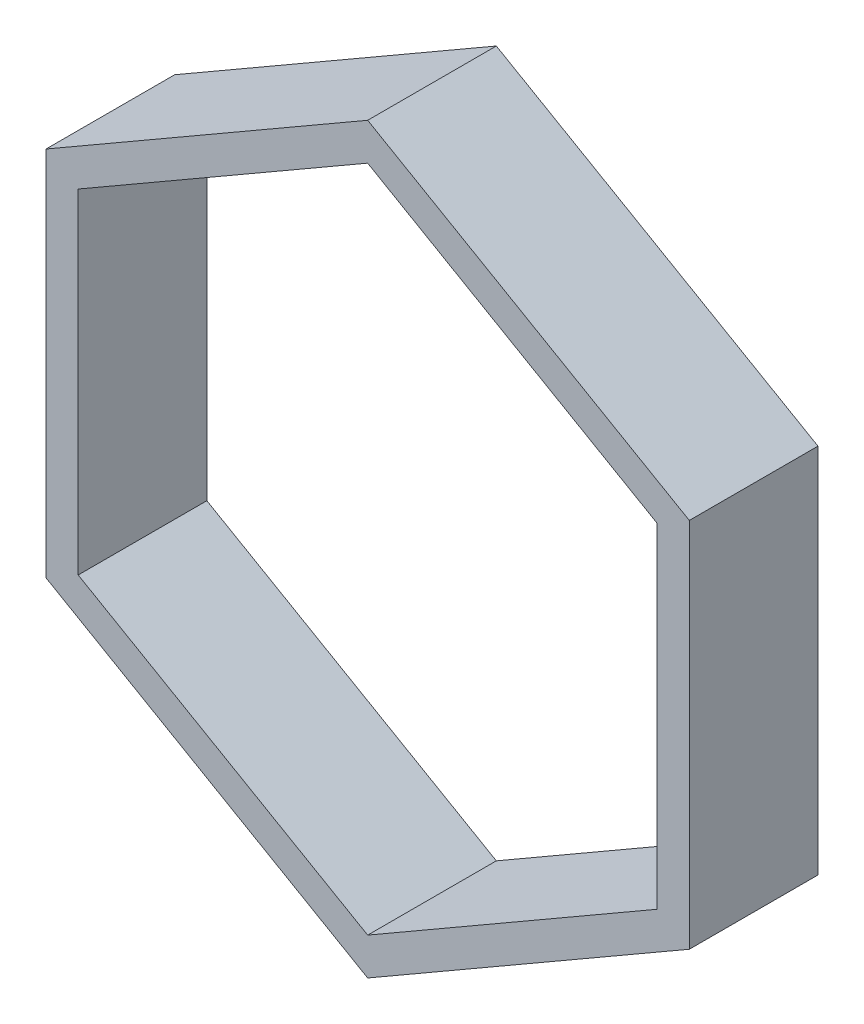
ISO-10303-21;
HEADER;
FILE_DESCRIPTION(('STEP AP214'),'2;1');
FILE_NAME('part.step','',(''),(''),'','','');
FILE_SCHEMA(('AUTOMOTIVE_DESIGN { 1 0 10303 214 1 1 1 1 }'));
ENDSEC;
DATA;
#1=APPLICATION_CONTEXT('core data for automotive mechanical design processes');
#2=APPLICATION_PROTOCOL_DEFINITION('international standard','automotive_design',2000,#1);
#3=PRODUCT_CONTEXT('',#1,'mechanical');
#4=PRODUCT('Part','Part','',(#3));
#5=PRODUCT_RELATED_PRODUCT_CATEGORY('part','',(#4));
#6=PRODUCT_DEFINITION_FORMATION('','',#4);
#7=PRODUCT_DEFINITION_CONTEXT('part definition',#1,'design');
#8=PRODUCT_DEFINITION('design','',#6,#7);
#9=PRODUCT_DEFINITION_SHAPE('','',#8);
#10=(LENGTH_UNIT() NAMED_UNIT(*) SI_UNIT(.MILLI.,.METRE.));
#11=(NAMED_UNIT(*) PLANE_ANGLE_UNIT() SI_UNIT($,.RADIAN.));
#12=(NAMED_UNIT(*) SI_UNIT($,.STERADIAN.) SOLID_ANGLE_UNIT());
#13=UNCERTAINTY_MEASURE_WITH_UNIT(LENGTH_MEASURE(1.E-05),#10,'distance_accuracy_value','');
#14=(GEOMETRIC_REPRESENTATION_CONTEXT(3) GLOBAL_UNCERTAINTY_ASSIGNED_CONTEXT((#13)) GLOBAL_UNIT_ASSIGNED_CONTEXT((#10,
#11,#12)) REPRESENTATION_CONTEXT('',''));
#15=CARTESIAN_POINT('',(0.,0.,0.));
#16=DIRECTION('',(0.,0.,1.));
#17=DIRECTION('',(1.,0.,0.));
#18=AXIS2_PLACEMENT_3D('',#15,#16,#17);
#19=CARTESIAN_POINT('',(0.,0.,4.));
#20=DIRECTION('',(0.,0.,1.));
#21=DIRECTION('',(1.,0.,0.));
#22=AXIS2_PLACEMENT_3D('',#19,#20,#21);
#23=PLANE('',#22);
#24=DIRECTION('',(-0.866025403784439,0.499999999999999,0.));
#25=VECTOR('',#24,1.);
#26=CARTESIAN_POINT('',(9.99999999999999,5.77350269189628,4.));
#27=LINE('',#26,#25);
#28=CARTESIAN_POINT('',(9.99999999999999,5.77350269189628,4.));
#29=VERTEX_POINT('',#28);
#30=CARTESIAN_POINT('',(0.,11.5470053837925,4.));
#31=VERTEX_POINT('',#30);
#32=EDGE_CURVE('E176',#29,#31,#27,.T.);
#33=ORIENTED_EDGE('',*,*,#32,.T.);
#34=DIRECTION('',(-0.866025403784439,-0.5,0.));
#35=VECTOR('',#34,1.);
#36=CARTESIAN_POINT('',(0.,11.5470053837925,4.));
#37=LINE('',#36,#35);
#38=CARTESIAN_POINT('',(-10.,5.77350269189628,4.));
#39=VERTEX_POINT('',#38);
#40=EDGE_CURVE('E179',#31,#39,#37,.T.);
#41=ORIENTED_EDGE('',*,*,#40,.T.);
#42=DIRECTION('',(0.,-1.,0.));
#43=VECTOR('',#42,1.);
#44=CARTESIAN_POINT('',(-10.,5.77350269189628,4.));
#45=LINE('',#44,#43);
#46=CARTESIAN_POINT('',(-10.,-5.77350269189624,4.));
#47=VERTEX_POINT('',#46);
#48=EDGE_CURVE('E182',#39,#47,#45,.T.);
#49=ORIENTED_EDGE('',*,*,#48,.T.);
#50=DIRECTION('',(0.866025403784439,-0.5,0.));
#51=VECTOR('',#50,1.);
#52=CARTESIAN_POINT('',(-10.,-5.77350269189624,4.));
#53=LINE('',#52,#51);
#54=CARTESIAN_POINT('',(0.,-11.5470053837925,4.));
#55=VERTEX_POINT('',#54);
#56=EDGE_CURVE('E184',#47,#55,#53,.T.);
#57=ORIENTED_EDGE('',*,*,#56,.T.);
#58=DIRECTION('',(0.866025403784439,0.5,0.));
#59=VECTOR('',#58,1.);
#60=CARTESIAN_POINT('',(0.,-11.5470053837925,4.));
#61=LINE('',#60,#59);
#62=CARTESIAN_POINT('',(9.99999999999999,-5.77350269189624,4.));
#63=VERTEX_POINT('',#62);
#64=EDGE_CURVE('E186',#55,#63,#61,.T.);
#65=ORIENTED_EDGE('',*,*,#64,.T.);
#66=DIRECTION('',(0.,1.,0.));
#67=VECTOR('',#66,1.);
#68=CARTESIAN_POINT('',(9.99999999999999,-5.77350269189624,4.));
#69=LINE('',#68,#67);
#70=EDGE_CURVE('E188',#63,#29,#69,.T.);
#71=ORIENTED_EDGE('',*,*,#70,.T.);
#72=EDGE_LOOP('',(#33,#41,#49,#57,#65,#71));
#73=FACE_BOUND('',#72,.T.);
#74=DIRECTION('',(-0.866025403784439,-0.499999999999999,0.));
#75=VECTOR('',#74,1.);
#76=CARTESIAN_POINT('',(0.,10.3923048454133,4.));
#77=LINE('',#76,#75);
#78=CARTESIAN_POINT('',(0.,10.3923048454133,4.));
#79=VERTEX_POINT('',#78);
#80=CARTESIAN_POINT('',(-9.,5.19615242270666,4.));
#81=VERTEX_POINT('',#80);
#82=EDGE_CURVE('E133',#79,#81,#77,.T.);
#83=ORIENTED_EDGE('',*,*,#82,.F.);
#84=DIRECTION('',(-0.866025403784439,0.5,0.));
#85=VECTOR('',#84,1.);
#86=CARTESIAN_POINT('',(8.99999999999999,5.19615242270665,4.));
#87=LINE('',#86,#85);
#88=CARTESIAN_POINT('',(8.99999999999999,5.19615242270665,4.));
#89=VERTEX_POINT('',#88);
#90=EDGE_CURVE('E125',#89,#79,#87,.T.);
#91=ORIENTED_EDGE('',*,*,#90,.F.);
#92=DIRECTION('',(0.,1.,0.));
#93=VECTOR('',#92,1.);
#94=CARTESIAN_POINT('',(8.99999999999999,-5.19615242270662,4.));
#95=LINE('',#94,#93);
#96=CARTESIAN_POINT('',(8.99999999999999,-5.19615242270662,4.));
#97=VERTEX_POINT('',#96);
#98=EDGE_CURVE('E154',#97,#89,#95,.T.);
#99=ORIENTED_EDGE('',*,*,#98,.F.);
#100=DIRECTION('',(0.866025403784439,0.5,0.));
#101=VECTOR('',#100,1.);
#102=CARTESIAN_POINT('',(0.,-10.3923048454132,4.));
#103=LINE('',#102,#101);
#104=CARTESIAN_POINT('',(0.,-10.3923048454132,4.));
#105=VERTEX_POINT('',#104);
#106=EDGE_CURVE('E152',#105,#97,#103,.T.);
#107=ORIENTED_EDGE('',*,*,#106,.F.);
#108=DIRECTION('',(0.866025403784439,-0.5,0.));
#109=VECTOR('',#108,1.);
#110=CARTESIAN_POINT('',(-9.,-5.19615242270662,4.));
#111=LINE('',#110,#109);
#112=CARTESIAN_POINT('',(-9.,-5.19615242270662,4.));
#113=VERTEX_POINT('',#112);
#114=EDGE_CURVE('E148',#113,#105,#111,.T.);
#115=ORIENTED_EDGE('',*,*,#114,.F.);
#116=DIRECTION('',(0.,-1.,0.));
#117=VECTOR('',#116,1.);
#118=CARTESIAN_POINT('',(-9.,5.19615242270666,4.));
#119=LINE('',#118,#117);
#120=EDGE_CURVE('E146',#81,#113,#119,.T.);
#121=ORIENTED_EDGE('',*,*,#120,.F.);
#122=EDGE_LOOP('',(#83,#91,#99,#107,#115,#121));
#123=FACE_BOUND('',#122,.T.);
#124=ADVANCED_FACE('F36',(#73,#123),#23,.T.);
#125=CARTESIAN_POINT('',(0.,0.,0.));
#126=DIRECTION('',(0.,0.,1.));
#127=DIRECTION('',(1.,0.,0.));
#128=AXIS2_PLACEMENT_3D('',#125,#126,#127);
#129=PLANE('',#128);
#130=DIRECTION('',(-0.866025403784439,0.499999999999999,0.));
#131=VECTOR('',#130,1.);
#132=CARTESIAN_POINT('',(9.99999999999999,5.77350269189628,0.));
#133=LINE('',#132,#131);
#134=CARTESIAN_POINT('',(9.99999999999999,5.77350269189628,0.));
#135=VERTEX_POINT('',#134);
#136=CARTESIAN_POINT('',(0.,11.5470053837925,0.));
#137=VERTEX_POINT('',#136);
#138=EDGE_CURVE('E141',#135,#137,#133,.T.);
#139=ORIENTED_EDGE('',*,*,#138,.F.);
#140=DIRECTION('',(0.,1.,0.));
#141=VECTOR('',#140,1.);
#142=CARTESIAN_POINT('',(9.99999999999999,-5.77350269189624,0.));
#143=LINE('',#142,#141);
#144=CARTESIAN_POINT('',(9.99999999999999,-5.77350269189624,0.));
#145=VERTEX_POINT('',#144);
#146=EDGE_CURVE('E180',#145,#135,#143,.T.);
#147=ORIENTED_EDGE('',*,*,#146,.F.);
#148=DIRECTION('',(0.866025403784439,0.5,0.));
#149=VECTOR('',#148,1.);
#150=CARTESIAN_POINT('',(0.,-11.5470053837925,0.));
#151=LINE('',#150,#149);
#152=CARTESIAN_POINT('',(0.,-11.5470053837925,0.));
#153=VERTEX_POINT('',#152);
#154=EDGE_CURVE('E199',#153,#145,#151,.T.);
#155=ORIENTED_EDGE('',*,*,#154,.F.);
#156=DIRECTION('',(0.866025403784439,-0.5,0.));
#157=VECTOR('',#156,1.);
#158=CARTESIAN_POINT('',(-10.,-5.77350269189624,0.));
#159=LINE('',#158,#157);
#160=CARTESIAN_POINT('',(-10.,-5.77350269189624,0.));
#161=VERTEX_POINT('',#160);
#162=EDGE_CURVE('E197',#161,#153,#159,.T.);
#163=ORIENTED_EDGE('',*,*,#162,.F.);
#164=DIRECTION('',(0.,-1.,0.));
#165=VECTOR('',#164,1.);
#166=CARTESIAN_POINT('',(-10.,5.77350269189628,0.));
#167=LINE('',#166,#165);
#168=CARTESIAN_POINT('',(-10.,5.77350269189628,0.));
#169=VERTEX_POINT('',#168);
#170=EDGE_CURVE('E195',#169,#161,#167,.T.);
#171=ORIENTED_EDGE('',*,*,#170,.F.);
#172=DIRECTION('',(-0.866025403784439,-0.5,0.));
#173=VECTOR('',#172,1.);
#174=CARTESIAN_POINT('',(0.,11.5470053837925,0.));
#175=LINE('',#174,#173);
#176=EDGE_CURVE('E193',#137,#169,#175,.T.);
#177=ORIENTED_EDGE('',*,*,#176,.F.);
#178=EDGE_LOOP('',(#139,#147,#155,#163,#171,#177));
#179=FACE_BOUND('',#178,.T.);
#180=DIRECTION('',(-0.866025403784439,0.5,0.));
#181=VECTOR('',#180,1.);
#182=CARTESIAN_POINT('',(8.99999999999999,5.19615242270665,0.));
#183=LINE('',#182,#181);
#184=CARTESIAN_POINT('',(8.99999999999999,5.19615242270665,0.));
#185=VERTEX_POINT('',#184);
#186=CARTESIAN_POINT('',(0.,10.3923048454133,0.));
#187=VERTEX_POINT('',#186);
#188=EDGE_CURVE('E59',#185,#187,#183,.T.);
#189=ORIENTED_EDGE('',*,*,#188,.T.);
#190=DIRECTION('',(-0.866025403784439,-0.499999999999999,0.));
#191=VECTOR('',#190,1.);
#192=CARTESIAN_POINT('',(0.,10.3923048454133,0.));
#193=LINE('',#192,#191);
#194=CARTESIAN_POINT('',(-9.,5.19615242270666,0.));
#195=VERTEX_POINT('',#194);
#196=EDGE_CURVE('E140',#187,#195,#193,.T.);
#197=ORIENTED_EDGE('',*,*,#196,.T.);
#198=DIRECTION('',(0.,-1.,0.));
#199=VECTOR('',#198,1.);
#200=CARTESIAN_POINT('',(-9.,5.19615242270666,0.));
#201=LINE('',#200,#199);
#202=CARTESIAN_POINT('',(-9.,-5.19615242270662,0.));
#203=VERTEX_POINT('',#202);
#204=EDGE_CURVE('E158',#195,#203,#201,.T.);
#205=ORIENTED_EDGE('',*,*,#204,.T.);
#206=DIRECTION('',(0.866025403784439,-0.5,0.));
#207=VECTOR('',#206,1.);
#208=CARTESIAN_POINT('',(-9.,-5.19615242270662,0.));
#209=LINE('',#208,#207);
#210=CARTESIAN_POINT('',(0.,-10.3923048454132,0.));
#211=VERTEX_POINT('',#210);
#212=EDGE_CURVE('E161',#203,#211,#209,.T.);
#213=ORIENTED_EDGE('',*,*,#212,.T.);
#214=DIRECTION('',(0.866025403784439,0.5,0.));
#215=VECTOR('',#214,1.);
#216=CARTESIAN_POINT('',(0.,-10.3923048454132,0.));
#217=LINE('',#216,#215);
#218=CARTESIAN_POINT('',(8.99999999999999,-5.19615242270662,0.));
#219=VERTEX_POINT('',#218);
#220=EDGE_CURVE('E164',#211,#219,#217,.T.);
#221=ORIENTED_EDGE('',*,*,#220,.T.);
#222=DIRECTION('',(0.,1.,0.));
#223=VECTOR('',#222,1.);
#224=CARTESIAN_POINT('',(8.99999999999999,-5.19615242270662,0.));
#225=LINE('',#224,#223);
#226=EDGE_CURVE('E134',#219,#185,#225,.T.);
#227=ORIENTED_EDGE('',*,*,#226,.T.);
#228=EDGE_LOOP('',(#189,#197,#205,#213,#221,#227));
#229=FACE_BOUND('',#228,.T.);
#230=ADVANCED_FACE('F223',(#179,#229),#129,.F.);
#231=CARTESIAN_POINT('',(9.99999999999999,5.77350269189628,4.));
#232=DIRECTION('',(-0.5,-0.866025403784439,0.));
#233=DIRECTION('',(0.866025403784439,-0.5,0.));
#234=AXIS2_PLACEMENT_3D('',#231,#232,#233);
#235=PLANE('',#234);
#236=ORIENTED_EDGE('',*,*,#138,.T.);
#237=DIRECTION('',(0.,0.,-1.));
#238=VECTOR('',#237,1.);
#239=CARTESIAN_POINT('',(0.,11.5470053837925,4.));
#240=LINE('',#239,#238);
#241=EDGE_CURVE('E11',#31,#137,#240,.T.);
#242=ORIENTED_EDGE('',*,*,#241,.F.);
#243=ORIENTED_EDGE('',*,*,#32,.F.);
#244=DIRECTION('',(0.,0.,-1.));
#245=VECTOR('',#244,1.);
#246=CARTESIAN_POINT('',(9.99999999999999,5.77350269189628,4.));
#247=LINE('',#246,#245);
#248=EDGE_CURVE('E190',#29,#135,#247,.T.);
#249=ORIENTED_EDGE('',*,*,#248,.T.);
#250=EDGE_LOOP('',(#236,#242,#243,#249));
#251=FACE_BOUND('',#250,.T.);
#252=ADVANCED_FACE('F38',(#251),#235,.F.);
#253=CARTESIAN_POINT('',(0.,11.5470053837925,4.));
#254=DIRECTION('',(0.5,-0.866025403784439,0.));
#255=DIRECTION('',(0.866025403784439,0.5,0.));
#256=AXIS2_PLACEMENT_3D('',#253,#254,#255);
#257=PLANE('',#256);
#258=ORIENTED_EDGE('',*,*,#176,.T.);
#259=DIRECTION('',(0.,0.,-1.));
#260=VECTOR('',#259,1.);
#261=CARTESIAN_POINT('',(-10.,5.77350269189628,4.));
#262=LINE('',#261,#260);
#263=EDGE_CURVE('E44',#39,#169,#262,.T.);
#264=ORIENTED_EDGE('',*,*,#263,.F.);
#265=ORIENTED_EDGE('',*,*,#40,.F.);
#266=ORIENTED_EDGE('',*,*,#241,.T.);
#267=EDGE_LOOP('',(#258,#264,#265,#266));
#268=FACE_BOUND('',#267,.T.);
#269=ADVANCED_FACE('F240',(#268),#257,.F.);
#270=CARTESIAN_POINT('',(-10.,5.77350269189628,4.));
#271=DIRECTION('',(1.,0.,0.));
#272=DIRECTION('',(0.,0.,-1.));
#273=AXIS2_PLACEMENT_3D('',#270,#271,#272);
#274=PLANE('',#273);
#275=ORIENTED_EDGE('',*,*,#170,.T.);
#276=DIRECTION('',(0.,0.,-1.));
#277=VECTOR('',#276,1.);
#278=CARTESIAN_POINT('',(-10.,-5.77350269189624,4.));
#279=LINE('',#278,#277);
#280=EDGE_CURVE('E210',#47,#161,#279,.T.);
#281=ORIENTED_EDGE('',*,*,#280,.F.);
#282=ORIENTED_EDGE('',*,*,#48,.F.);
#283=ORIENTED_EDGE('',*,*,#263,.T.);
#284=EDGE_LOOP('',(#275,#281,#282,#283));
#285=FACE_BOUND('',#284,.T.);
#286=ADVANCED_FACE('F217',(#285),#274,.F.);
#287=CARTESIAN_POINT('',(-10.,-5.77350269189624,4.));
#288=DIRECTION('',(0.5,0.866025403784439,0.));
#289=DIRECTION('',(-0.866025403784439,0.5,0.));
#290=AXIS2_PLACEMENT_3D('',#287,#288,#289);
#291=PLANE('',#290);
#292=ORIENTED_EDGE('',*,*,#162,.T.);
#293=DIRECTION('',(0.,0.,-1.));
#294=VECTOR('',#293,1.);
#295=CARTESIAN_POINT('',(0.,-11.5470053837925,4.));
#296=LINE('',#295,#294);
#297=EDGE_CURVE('E207',#55,#153,#296,.T.);
#298=ORIENTED_EDGE('',*,*,#297,.F.);
#299=ORIENTED_EDGE('',*,*,#56,.F.);
#300=ORIENTED_EDGE('',*,*,#280,.T.);
#301=EDGE_LOOP('',(#292,#298,#299,#300));
#302=FACE_BOUND('',#301,.T.);
#303=ADVANCED_FACE('F229',(#302),#291,.F.);
#304=CARTESIAN_POINT('',(0.,-11.5470053837925,4.));
#305=DIRECTION('',(-0.5,0.866025403784439,0.));
#306=DIRECTION('',(-0.866025403784439,-0.5,0.));
#307=AXIS2_PLACEMENT_3D('',#304,#305,#306);
#308=PLANE('',#307);
#309=ORIENTED_EDGE('',*,*,#154,.T.);
#310=DIRECTION('',(0.,0.,-1.));
#311=VECTOR('',#310,1.);
#312=CARTESIAN_POINT('',(9.99999999999999,-5.77350269189624,4.));
#313=LINE('',#312,#311);
#314=EDGE_CURVE('E204',#63,#145,#313,.T.);
#315=ORIENTED_EDGE('',*,*,#314,.F.);
#316=ORIENTED_EDGE('',*,*,#64,.F.);
#317=ORIENTED_EDGE('',*,*,#297,.T.);
#318=EDGE_LOOP('',(#309,#315,#316,#317));
#319=FACE_BOUND('',#318,.T.);
#320=ADVANCED_FACE('F233',(#319),#308,.F.);
#321=CARTESIAN_POINT('',(9.99999999999999,-5.77350269189624,4.));
#322=DIRECTION('',(-1.,0.,0.));
#323=DIRECTION('',(0.,-1.,0.));
#324=AXIS2_PLACEMENT_3D('',#321,#322,#323);
#325=PLANE('',#324);
#326=ORIENTED_EDGE('',*,*,#146,.T.);
#327=ORIENTED_EDGE('',*,*,#248,.F.);
#328=ORIENTED_EDGE('',*,*,#70,.F.);
#329=ORIENTED_EDGE('',*,*,#314,.T.);
#330=EDGE_LOOP('',(#326,#327,#328,#329));
#331=FACE_BOUND('',#330,.T.);
#332=ADVANCED_FACE('F243',(#331),#325,.F.);
#333=CARTESIAN_POINT('',(8.99999999999999,5.19615242270665,4.));
#334=DIRECTION('',(-0.5,-0.866025403784439,0.));
#335=DIRECTION('',(0.866025403784439,-0.5,0.));
#336=AXIS2_PLACEMENT_3D('',#333,#334,#335);
#337=PLANE('',#336);
#338=ORIENTED_EDGE('',*,*,#188,.F.);
#339=DIRECTION('',(0.,0.,-1.));
#340=VECTOR('',#339,1.);
#341=CARTESIAN_POINT('',(8.99999999999999,5.19615242270665,4.));
#342=LINE('',#341,#340);
#343=EDGE_CURVE('E129',#89,#185,#342,.T.);
#344=ORIENTED_EDGE('',*,*,#343,.F.);
#345=ORIENTED_EDGE('',*,*,#90,.T.);
#346=DIRECTION('',(0.,0.,-1.));
#347=VECTOR('',#346,1.);
#348=CARTESIAN_POINT('',(0.,10.3923048454133,4.));
#349=LINE('',#348,#347);
#350=EDGE_CURVE('E128',#79,#187,#349,.T.);
#351=ORIENTED_EDGE('',*,*,#350,.T.);
#352=EDGE_LOOP('',(#338,#344,#345,#351));
#353=FACE_BOUND('',#352,.T.);
#354=ADVANCED_FACE('F127',(#353),#337,.T.);
#355=CARTESIAN_POINT('',(0.,10.3923048454133,4.));
#356=DIRECTION('',(0.499999999999999,-0.866025403784439,0.));
#357=DIRECTION('',(0.866025403784439,0.499999999999999,0.));
#358=AXIS2_PLACEMENT_3D('',#355,#356,#357);
#359=PLANE('',#358);
#360=ORIENTED_EDGE('',*,*,#196,.F.);
#361=ORIENTED_EDGE('',*,*,#350,.F.);
#362=ORIENTED_EDGE('',*,*,#82,.T.);
#363=DIRECTION('',(0.,0.,-1.));
#364=VECTOR('',#363,1.);
#365=CARTESIAN_POINT('',(-9.,5.19615242270666,4.));
#366=LINE('',#365,#364);
#367=EDGE_CURVE('E142',#81,#195,#366,.T.);
#368=ORIENTED_EDGE('',*,*,#367,.T.);
#369=EDGE_LOOP('',(#360,#361,#362,#368));
#370=FACE_BOUND('',#369,.T.);
#371=ADVANCED_FACE('F137',(#370),#359,.T.);
#372=CARTESIAN_POINT('',(-9.,5.19615242270666,4.));
#373=DIRECTION('',(1.,0.,0.));
#374=DIRECTION('',(0.,0.,-1.));
#375=AXIS2_PLACEMENT_3D('',#372,#373,#374);
#376=PLANE('',#375);
#377=ORIENTED_EDGE('',*,*,#204,.F.);
#378=ORIENTED_EDGE('',*,*,#367,.F.);
#379=ORIENTED_EDGE('',*,*,#120,.T.);
#380=DIRECTION('',(0.,0.,-1.));
#381=VECTOR('',#380,1.);
#382=CARTESIAN_POINT('',(-9.,-5.19615242270662,4.));
#383=LINE('',#382,#381);
#384=EDGE_CURVE('E173',#113,#203,#383,.T.);
#385=ORIENTED_EDGE('',*,*,#384,.T.);
#386=EDGE_LOOP('',(#377,#378,#379,#385));
#387=FACE_BOUND('',#386,.T.);
#388=ADVANCED_FACE('F261',(#387),#376,.T.);
#389=CARTESIAN_POINT('',(-9.,-5.19615242270662,4.));
#390=DIRECTION('',(0.5,0.866025403784439,0.));
#391=DIRECTION('',(-0.866025403784439,0.5,0.));
#392=AXIS2_PLACEMENT_3D('',#389,#390,#391);
#393=PLANE('',#392);
#394=ORIENTED_EDGE('',*,*,#212,.F.);
#395=ORIENTED_EDGE('',*,*,#384,.F.);
#396=ORIENTED_EDGE('',*,*,#114,.T.);
#397=DIRECTION('',(0.,0.,-1.));
#398=VECTOR('',#397,1.);
#399=CARTESIAN_POINT('',(0.,-10.3923048454132,4.));
#400=LINE('',#399,#398);
#401=EDGE_CURVE('E171',#105,#211,#400,.T.);
#402=ORIENTED_EDGE('',*,*,#401,.T.);
#403=EDGE_LOOP('',(#394,#395,#396,#402));
#404=FACE_BOUND('',#403,.T.);
#405=ADVANCED_FACE('F264',(#404),#393,.T.);
#406=CARTESIAN_POINT('',(0.,-10.3923048454132,4.));
#407=DIRECTION('',(-0.5,0.866025403784439,0.));
#408=DIRECTION('',(-0.866025403784439,-0.5,0.));
#409=AXIS2_PLACEMENT_3D('',#406,#407,#408);
#410=PLANE('',#409);
#411=ORIENTED_EDGE('',*,*,#220,.F.);
#412=ORIENTED_EDGE('',*,*,#401,.F.);
#413=ORIENTED_EDGE('',*,*,#106,.T.);
#414=DIRECTION('',(0.,0.,-1.));
#415=VECTOR('',#414,1.);
#416=CARTESIAN_POINT('',(8.99999999999999,-5.19615242270662,4.));
#417=LINE('',#416,#415);
#418=EDGE_CURVE('E51',#97,#219,#417,.T.);
#419=ORIENTED_EDGE('',*,*,#418,.T.);
#420=EDGE_LOOP('',(#411,#412,#413,#419));
#421=FACE_BOUND('',#420,.T.);
#422=ADVANCED_FACE('F268',(#421),#410,.T.);
#423=CARTESIAN_POINT('',(8.99999999999999,-5.19615242270662,4.));
#424=DIRECTION('',(-1.,0.,0.));
#425=DIRECTION('',(0.,-1.,0.));
#426=AXIS2_PLACEMENT_3D('',#423,#424,#425);
#427=PLANE('',#426);
#428=ORIENTED_EDGE('',*,*,#226,.F.);
#429=ORIENTED_EDGE('',*,*,#418,.F.);
#430=ORIENTED_EDGE('',*,*,#98,.T.);
#431=ORIENTED_EDGE('',*,*,#343,.T.);
#432=EDGE_LOOP('',(#428,#429,#430,#431));
#433=FACE_BOUND('',#432,.T.);
#434=ADVANCED_FACE('F272',(#433),#427,.T.);
#435=CLOSED_SHELL('',(#124,#230,#252,#269,#286,#303,#320,#332,#354,#371,#388,#405,#422,#434));
#436=MANIFOLD_SOLID_BREP('B2',#435);
#437=ADVANCED_BREP_SHAPE_REPRESENTATION('',(#18,#436),#14);
#438=SHAPE_DEFINITION_REPRESENTATION(#9,#437);
ENDSEC;
END-ISO-10303-21;
